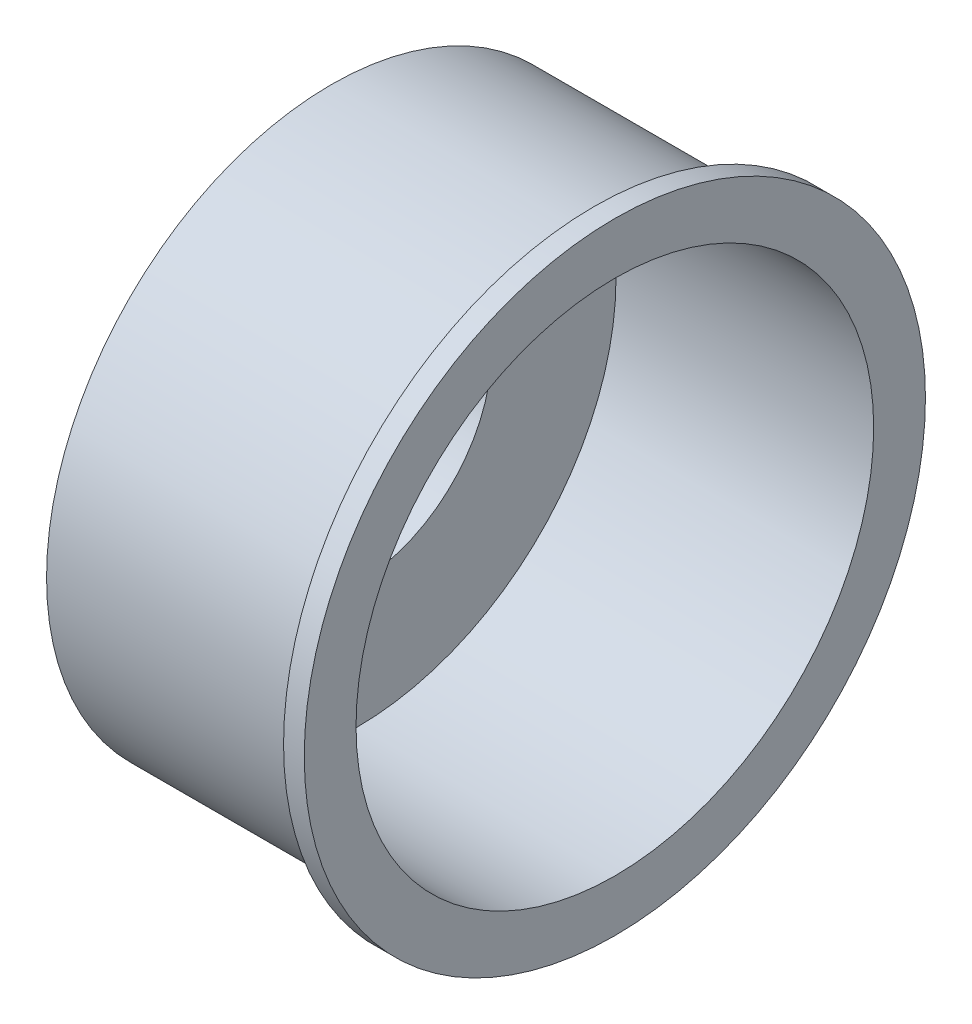
ISO-10303-21;
HEADER;
FILE_DESCRIPTION(('STEP AP214'),'2;1');
FILE_NAME('part.step','',(''),(''),'','','');
FILE_SCHEMA(('AUTOMOTIVE_DESIGN { 1 0 10303 214 1 1 1 1 }'));
ENDSEC;
DATA;
#1=APPLICATION_CONTEXT('core data for automotive mechanical design processes');
#2=APPLICATION_PROTOCOL_DEFINITION('international standard','automotive_design',2000,#1);
#3=PRODUCT_CONTEXT('',#1,'mechanical');
#4=PRODUCT('Part','Part','',(#3));
#5=PRODUCT_RELATED_PRODUCT_CATEGORY('part','',(#4));
#6=PRODUCT_DEFINITION_FORMATION('','',#4);
#7=PRODUCT_DEFINITION_CONTEXT('part definition',#1,'design');
#8=PRODUCT_DEFINITION('design','',#6,#7);
#9=PRODUCT_DEFINITION_SHAPE('','',#8);
#10=(LENGTH_UNIT() NAMED_UNIT(*) SI_UNIT(.MILLI.,.METRE.));
#11=(NAMED_UNIT(*) PLANE_ANGLE_UNIT() SI_UNIT($,.RADIAN.));
#12=(NAMED_UNIT(*) SI_UNIT($,.STERADIAN.) SOLID_ANGLE_UNIT());
#13=UNCERTAINTY_MEASURE_WITH_UNIT(LENGTH_MEASURE(1.E-05),#10,'distance_accuracy_value','');
#14=(GEOMETRIC_REPRESENTATION_CONTEXT(3) GLOBAL_UNCERTAINTY_ASSIGNED_CONTEXT((#13)) GLOBAL_UNIT_ASSIGNED_CONTEXT((#10,
#11,#12)) REPRESENTATION_CONTEXT('',''));
#15=CARTESIAN_POINT('',(0.,0.,0.));
#16=DIRECTION('',(0.,0.,1.));
#17=DIRECTION('',(1.,0.,0.));
#18=AXIS2_PLACEMENT_3D('',#15,#16,#17);
#19=CARTESIAN_POINT('',(-500.,0.,0.));
#20=DIRECTION('',(-1.,0.,0.));
#21=DIRECTION('',(0.,0.,1.));
#22=AXIS2_PLACEMENT_3D('',#19,#20,#21);
#23=CYLINDRICAL_SURFACE('',#22,50.);
#24=CARTESIAN_POINT('',(5.,0.,0.));
#25=DIRECTION('',(-1.,0.,0.));
#26=DIRECTION('',(0.,0.,1.));
#27=AXIS2_PLACEMENT_3D('',#24,#25,#26);
#28=CIRCLE('',#27,50.);
#29=CARTESIAN_POINT('',(5.,0.,50.));
#30=VERTEX_POINT('',#29);
#31=EDGE_CURVE('E56',#30,#30,#28,.T.);
#32=ORIENTED_EDGE('',*,*,#31,.T.);
#33=EDGE_LOOP('',(#32));
#34=FACE_BOUND('',#33,.T.);
#35=CARTESIAN_POINT('',(54.7843314731131,0.,0.));
#36=DIRECTION('',(-1.,0.,0.));
#37=DIRECTION('',(0.,0.,1.));
#38=AXIS2_PLACEMENT_3D('',#35,#36,#37);
#39=CIRCLE('',#38,50.);
#40=CARTESIAN_POINT('',(54.7843314731131,0.,50.));
#41=VERTEX_POINT('',#40);
#42=EDGE_CURVE('E59',#41,#41,#39,.T.);
#43=ORIENTED_EDGE('',*,*,#42,.F.);
#44=EDGE_LOOP('',(#43));
#45=FACE_BOUND('',#44,.T.);
#46=ADVANCED_FACE('F33',(#34,#45),#23,.F.);
#47=CARTESIAN_POINT('',(54.7843314731131,0.,0.));
#48=DIRECTION('',(-1.,0.,0.));
#49=DIRECTION('',(0.,0.,1.));
#50=AXIS2_PLACEMENT_3D('',#47,#48,#49);
#51=PLANE('',#50);
#52=CARTESIAN_POINT('',(54.7843314731131,0.,0.));
#53=DIRECTION('',(-1.,0.,0.));
#54=DIRECTION('',(0.,0.,1.));
#55=AXIS2_PLACEMENT_3D('',#52,#53,#54);
#56=CIRCLE('',#55,60.);
#57=CARTESIAN_POINT('',(54.7843314731131,0.,60.));
#58=VERTEX_POINT('',#57);
#59=EDGE_CURVE('E62',#58,#58,#56,.T.);
#60=ORIENTED_EDGE('',*,*,#59,.F.);
#61=EDGE_LOOP('',(#60));
#62=FACE_BOUND('',#61,.T.);
#63=ORIENTED_EDGE('',*,*,#42,.T.);
#64=EDGE_LOOP('',(#63));
#65=FACE_BOUND('',#64,.T.);
#66=ADVANCED_FACE('F67',(#62,#65),#51,.F.);
#67=CARTESIAN_POINT('',(-500.,0.,0.));
#68=DIRECTION('',(-1.,0.,0.));
#69=DIRECTION('',(0.,0.,1.));
#70=AXIS2_PLACEMENT_3D('',#67,#68,#69);
#71=CYLINDRICAL_SURFACE('',#70,60.);
#72=CARTESIAN_POINT('',(50.7843314731131,0.,0.));
#73=DIRECTION('',(-1.,0.,0.));
#74=DIRECTION('',(0.,0.,1.));
#75=AXIS2_PLACEMENT_3D('',#72,#73,#74);
#76=CIRCLE('',#75,60.);
#77=CARTESIAN_POINT('',(50.7843314731131,0.,60.));
#78=VERTEX_POINT('',#77);
#79=EDGE_CURVE('E10',#78,#78,#76,.T.);
#80=ORIENTED_EDGE('',*,*,#79,.F.);
#81=EDGE_LOOP('',(#80));
#82=FACE_BOUND('',#81,.T.);
#83=ORIENTED_EDGE('',*,*,#59,.T.);
#84=EDGE_LOOP('',(#83));
#85=FACE_BOUND('',#84,.T.);
#86=ADVANCED_FACE('F35',(#82,#85),#71,.T.);
#87=CARTESIAN_POINT('',(5.,0.,0.));
#88=DIRECTION('',(1.,0.,0.));
#89=DIRECTION('',(0.,0.,-1.));
#90=AXIS2_PLACEMENT_3D('',#87,#88,#89);
#91=PLANE('',#90);
#92=CARTESIAN_POINT('',(5.,0.,0.));
#93=DIRECTION('',(-1.,0.,0.));
#94=DIRECTION('',(0.,0.,1.));
#95=AXIS2_PLACEMENT_3D('',#92,#93,#94);
#96=CIRCLE('',#95,26.);
#97=CARTESIAN_POINT('',(5.,0.,26.));
#98=VERTEX_POINT('',#97);
#99=EDGE_CURVE('E53',#98,#98,#96,.T.);
#100=ORIENTED_EDGE('',*,*,#99,.T.);
#101=EDGE_LOOP('',(#100));
#102=FACE_BOUND('',#101,.T.);
#103=ORIENTED_EDGE('',*,*,#31,.F.);
#104=EDGE_LOOP('',(#103));
#105=FACE_BOUND('',#104,.T.);
#106=ADVANCED_FACE('F80',(#102,#105),#91,.T.);
#107=CARTESIAN_POINT('',(-500.,0.,0.));
#108=DIRECTION('',(-1.,0.,0.));
#109=DIRECTION('',(0.,0.,1.));
#110=AXIS2_PLACEMENT_3D('',#107,#108,#109);
#111=CYLINDRICAL_SURFACE('',#110,26.);
#112=CARTESIAN_POINT('',(0.,0.,0.));
#113=DIRECTION('',(-1.,0.,0.));
#114=DIRECTION('',(0.,0.,1.));
#115=AXIS2_PLACEMENT_3D('',#112,#113,#114);
#116=CIRCLE('',#115,26.);
#117=CARTESIAN_POINT('',(0.,0.,26.));
#118=VERTEX_POINT('',#117);
#119=EDGE_CURVE('E48',#118,#118,#116,.T.);
#120=ORIENTED_EDGE('',*,*,#119,.T.);
#121=EDGE_LOOP('',(#120));
#122=FACE_BOUND('',#121,.T.);
#123=ORIENTED_EDGE('',*,*,#99,.F.);
#124=EDGE_LOOP('',(#123));
#125=FACE_BOUND('',#124,.T.);
#126=ADVANCED_FACE('F85',(#122,#125),#111,.F.);
#127=CARTESIAN_POINT('',(0.,0.,0.));
#128=DIRECTION('',(1.,0.,0.));
#129=DIRECTION('',(0.,0.,-1.));
#130=AXIS2_PLACEMENT_3D('',#127,#128,#129);
#131=PLANE('',#130);
#132=ORIENTED_EDGE('',*,*,#119,.F.);
#133=EDGE_LOOP('',(#132));
#134=FACE_BOUND('',#133,.T.);
#135=CARTESIAN_POINT('',(0.,0.,0.));
#136=DIRECTION('',(-1.,0.,0.));
#137=DIRECTION('',(0.,0.,1.));
#138=AXIS2_PLACEMENT_3D('',#135,#136,#137);
#139=CIRCLE('',#138,55.);
#140=CARTESIAN_POINT('',(0.,0.,55.));
#141=VERTEX_POINT('',#140);
#142=EDGE_CURVE('E44',#141,#141,#139,.T.);
#143=ORIENTED_EDGE('',*,*,#142,.T.);
#144=EDGE_LOOP('',(#143));
#145=FACE_BOUND('',#144,.T.);
#146=ADVANCED_FACE('F90',(#134,#145),#131,.F.);
#147=CARTESIAN_POINT('',(-500.,0.,0.));
#148=DIRECTION('',(-1.,0.,0.));
#149=DIRECTION('',(0.,0.,1.));
#150=AXIS2_PLACEMENT_3D('',#147,#148,#149);
#151=CYLINDRICAL_SURFACE('',#150,55.);
#152=CARTESIAN_POINT('',(50.7843314731131,0.,0.));
#153=DIRECTION('',(-1.,0.,0.));
#154=DIRECTION('',(0.,0.,1.));
#155=AXIS2_PLACEMENT_3D('',#152,#153,#154);
#156=CIRCLE('',#155,55.);
#157=CARTESIAN_POINT('',(50.7843314731131,0.,55.));
#158=VERTEX_POINT('',#157);
#159=EDGE_CURVE('E40',#158,#158,#156,.T.);
#160=ORIENTED_EDGE('',*,*,#159,.T.);
#161=EDGE_LOOP('',(#160));
#162=FACE_BOUND('',#161,.T.);
#163=ORIENTED_EDGE('',*,*,#142,.F.);
#164=EDGE_LOOP('',(#163));
#165=FACE_BOUND('',#164,.T.);
#166=ADVANCED_FACE('F97',(#162,#165),#151,.T.);
#167=CARTESIAN_POINT('',(50.7843314731131,0.,0.));
#168=DIRECTION('',(1.,0.,0.));
#169=DIRECTION('',(0.,0.,-1.));
#170=AXIS2_PLACEMENT_3D('',#167,#168,#169);
#171=PLANE('',#170);
#172=ORIENTED_EDGE('',*,*,#159,.F.);
#173=EDGE_LOOP('',(#172));
#174=FACE_BOUND('',#173,.T.);
#175=ORIENTED_EDGE('',*,*,#79,.T.);
#176=EDGE_LOOP('',(#175));
#177=FACE_BOUND('',#176,.T.);
#178=ADVANCED_FACE('F100',(#174,#177),#171,.F.);
#179=CLOSED_SHELL('',(#46,#66,#86,#106,#126,#146,#166,#178));
#180=MANIFOLD_SOLID_BREP('B2',#179);
#181=ADVANCED_BREP_SHAPE_REPRESENTATION('',(#18,#180),#14);
#182=SHAPE_DEFINITION_REPRESENTATION(#9,#181);
ENDSEC;
END-ISO-10303-21;
